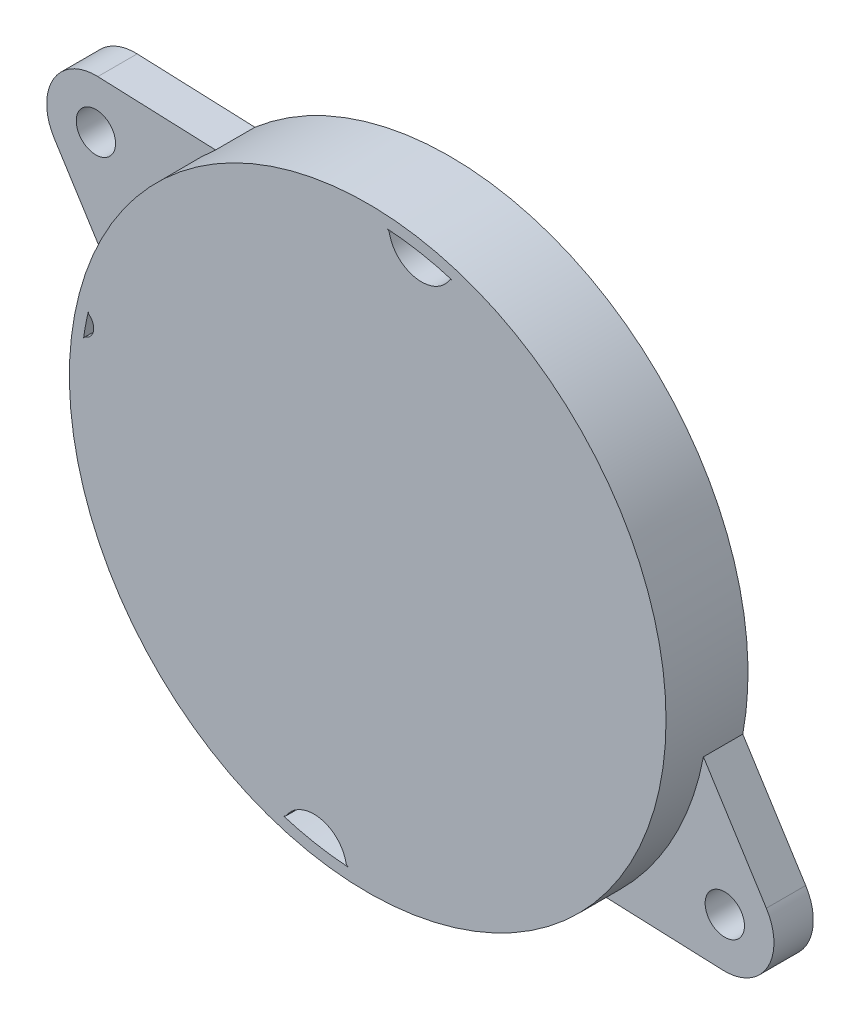
ISO-10303-21;
HEADER;
FILE_DESCRIPTION(('STEP AP214'),'2;1');
FILE_NAME('part.step','',(''),(''),'','','');
FILE_SCHEMA(('AUTOMOTIVE_DESIGN { 1 0 10303 214 1 1 1 1 }'));
ENDSEC;
DATA;
#1=APPLICATION_CONTEXT('core data for automotive mechanical design processes');
#2=APPLICATION_PROTOCOL_DEFINITION('international standard','automotive_design',2000,#1);
#3=PRODUCT_CONTEXT('',#1,'mechanical');
#4=PRODUCT('Part','Part','',(#3));
#5=PRODUCT_RELATED_PRODUCT_CATEGORY('part','',(#4));
#6=PRODUCT_DEFINITION_FORMATION('','',#4);
#7=PRODUCT_DEFINITION_CONTEXT('part definition',#1,'design');
#8=PRODUCT_DEFINITION('design','',#6,#7);
#9=PRODUCT_DEFINITION_SHAPE('','',#8);
#10=(LENGTH_UNIT() NAMED_UNIT(*) SI_UNIT(.MILLI.,.METRE.));
#11=(NAMED_UNIT(*) PLANE_ANGLE_UNIT() SI_UNIT($,.RADIAN.));
#12=(NAMED_UNIT(*) SI_UNIT($,.STERADIAN.) SOLID_ANGLE_UNIT());
#13=UNCERTAINTY_MEASURE_WITH_UNIT(LENGTH_MEASURE(1.E-05),#10,'distance_accuracy_value','');
#14=(GEOMETRIC_REPRESENTATION_CONTEXT(3) GLOBAL_UNCERTAINTY_ASSIGNED_CONTEXT((#13)) GLOBAL_UNIT_ASSIGNED_CONTEXT((#10,
#11,#12)) REPRESENTATION_CONTEXT('',''));
#15=CARTESIAN_POINT('',(0.,0.,0.));
#16=DIRECTION('',(0.,0.,1.));
#17=DIRECTION('',(1.,0.,0.));
#18=AXIS2_PLACEMENT_3D('',#15,#16,#17);
#19=CARTESIAN_POINT('',(0.,0.,5.));
#20=DIRECTION('',(0.,0.,-1.));
#21=DIRECTION('',(-1.,0.,0.));
#22=AXIS2_PLACEMENT_3D('',#19,#20,#21);
#23=CYLINDRICAL_SURFACE('',#22,18.2);
#24=CARTESIAN_POINT('',(0.,0.,5.));
#25=DIRECTION('',(0.,0.,1.));
#26=DIRECTION('',(1.,0.,0.));
#27=AXIS2_PLACEMENT_3D('',#24,#25,#26);
#28=CIRCLE('',#27,18.2);
#29=CARTESIAN_POINT('',(18.2,0.,5.));
#30=VERTEX_POINT('',#29);
#31=EDGE_CURVE('E346',#30,#30,#28,.T.);
#32=ORIENTED_EDGE('',*,*,#31,.F.);
#33=EDGE_LOOP('',(#32));
#34=FACE_BOUND('',#33,.T.);
#35=DIRECTION('',(0.,0.,-1.));
#36=VECTOR('',#35,1.);
#37=CARTESIAN_POINT('',(11.8804319684403,-13.7875065274059,2.4));
#38=LINE('',#37,#36);
#39=CARTESIAN_POINT('',(11.8804319684403,-13.7875065274059,2.4));
#40=VERTEX_POINT('',#39);
#41=CARTESIAN_POINT('',(11.8804319684403,-13.7875065274059,0.));
#42=VERTEX_POINT('',#41);
#43=EDGE_CURVE('E55',#40,#42,#38,.T.);
#44=ORIENTED_EDGE('',*,*,#43,.F.);
#45=CARTESIAN_POINT('',(0.,0.,2.4));
#46=DIRECTION('',(0.,0.,-1.));
#47=DIRECTION('',(1.,0.,0.));
#48=AXIS2_PLACEMENT_3D('',#45,#46,#47);
#49=CIRCLE('',#48,18.2);
#50=CARTESIAN_POINT('',(17.8805468917975,-3.39500262889909,2.4));
#51=VERTEX_POINT('',#50);
#52=EDGE_CURVE('E60',#51,#40,#49,.T.);
#53=ORIENTED_EDGE('',*,*,#52,.F.);
#54=DIRECTION('',(0.,0.,-1.));
#55=VECTOR('',#54,1.);
#56=CARTESIAN_POINT('',(17.8805468917975,-3.39500262889909,2.4));
#57=LINE('',#56,#55);
#58=CARTESIAN_POINT('',(17.8805468917975,-3.39500262889909,0.));
#59=VERTEX_POINT('',#58);
#60=EDGE_CURVE('E198',#51,#59,#57,.T.);
#61=ORIENTED_EDGE('',*,*,#60,.T.);
#62=CARTESIAN_POINT('',(0.,0.,0.));
#63=DIRECTION('',(0.,0.,1.));
#64=DIRECTION('',(1.,0.,0.));
#65=AXIS2_PLACEMENT_3D('',#62,#63,#64);
#66=CIRCLE('',#65,18.2);
#67=CARTESIAN_POINT('',(-11.8804319684404,13.7875065274059,0.));
#68=VERTEX_POINT('',#67);
#69=EDGE_CURVE('E339',#59,#68,#66,.T.);
#70=ORIENTED_EDGE('',*,*,#69,.T.);
#71=DIRECTION('',(0.,0.,-1.));
#72=VECTOR('',#71,1.);
#73=CARTESIAN_POINT('',(-11.8804319684403,13.7875065274059,2.4));
#74=LINE('',#73,#72);
#75=CARTESIAN_POINT('',(-11.8804319684403,13.7875065274059,2.4));
#76=VERTEX_POINT('',#75);
#77=EDGE_CURVE('E240',#76,#68,#74,.T.);
#78=ORIENTED_EDGE('',*,*,#77,.F.);
#79=CARTESIAN_POINT('',(0.,0.,2.4));
#80=DIRECTION('',(0.,0.,-1.));
#81=DIRECTION('',(1.,0.,0.));
#82=AXIS2_PLACEMENT_3D('',#79,#80,#81);
#83=CIRCLE('',#82,18.2);
#84=CARTESIAN_POINT('',(-17.8805468917975,3.3950026288991,2.4));
#85=VERTEX_POINT('',#84);
#86=EDGE_CURVE('E226',#85,#76,#83,.T.);
#87=ORIENTED_EDGE('',*,*,#86,.F.);
#88=DIRECTION('',(0.,0.,-1.));
#89=VECTOR('',#88,1.);
#90=CARTESIAN_POINT('',(-17.8805468917975,3.39500262889908,2.4));
#91=LINE('',#90,#89);
#92=CARTESIAN_POINT('',(-17.8805468917975,3.39500262889908,0.));
#93=VERTEX_POINT('',#92);
#94=EDGE_CURVE('E243',#85,#93,#91,.T.);
#95=ORIENTED_EDGE('',*,*,#94,.T.);
#96=EDGE_CURVE('E350',#93,#42,#66,.T.);
#97=ORIENTED_EDGE('',*,*,#96,.T.);
#98=EDGE_LOOP('',(#44,#53,#61,#70,#78,#87,#95,#97));
#99=FACE_BOUND('',#98,.T.);
#100=ADVANCED_FACE('F39',(#34,#99),#23,.T.);
#101=CARTESIAN_POINT('',(0.,0.,5.));
#102=DIRECTION('',(0.,0.,1.));
#103=DIRECTION('',(1.,0.,0.));
#104=AXIS2_PLACEMENT_3D('',#101,#102,#103);
#105=PLANE('',#104);
#106=CARTESIAN_POINT('',(-5.14026382170794,-16.518707208594,5.));
#107=DIRECTION('',(0.,0.,-1.));
#108=DIRECTION('',(1.,0.,0.));
#109=AXIS2_PLACEMENT_3D('',#106,#107,#108);
#110=CIRCLE('',#109,0.200000000000027);
#111=CARTESIAN_POINT('',(-4.97142911747537,-16.6259212125613,5.));
#112=VERTEX_POINT('',#111);
#113=CARTESIAN_POINT('',(-5.19968883698777,-16.7096749219882,5.));
#114=VERTEX_POINT('',#113);
#115=EDGE_CURVE('E249',#112,#114,#110,.T.);
#116=ORIENTED_EDGE('',*,*,#115,.F.);
#117=CARTESIAN_POINT('',(-3.28308207514968,-17.6980612522336,5.));
#118=DIRECTION('',(0.,0.,1.));
#119=DIRECTION('',(1.,0.,0.));
#120=AXIS2_PLACEMENT_3D('',#117,#118,#119);
#121=CIRCLE('',#120,1.99999999999958);
#122=CARTESIAN_POINT('',(-1.32252662844535,-17.3028115331997,5.));
#123=VERTEX_POINT('',#122);
#124=EDGE_CURVE('E254',#123,#112,#121,.T.);
#125=ORIENTED_EDGE('',*,*,#124,.F.);
#126=CARTESIAN_POINT('',(-1.12647108377492,-17.2632865612964,5.));
#127=DIRECTION('',(0.,0.,-1.));
#128=DIRECTION('',(1.,0.,0.));
#129=AXIS2_PLACEMENT_3D('',#126,#127,#128);
#130=CIRCLE('',#129,0.199999999999947);
#131=CARTESIAN_POINT('',(-1.13949387087031,-17.462862128479,5.));
#132=VERTEX_POINT('',#131);
#133=EDGE_CURVE('E268',#132,#123,#130,.T.);
#134=ORIENTED_EDGE('',*,*,#133,.F.);
#135=CARTESIAN_POINT('',(0.,0.,5.));
#136=DIRECTION('',(0.,0.,1.));
#137=DIRECTION('',(1.,0.,0.));
#138=AXIS2_PLACEMENT_3D('',#135,#136,#137);
#139=CIRCLE('',#138,17.5000000000005);
#140=EDGE_CURVE('E265',#114,#132,#139,.T.);
#141=ORIENTED_EDGE('',*,*,#140,.F.);
#142=EDGE_LOOP('',(#116,#125,#134,#141));
#143=FACE_BOUND('',#142,.T.);
#144=CARTESIAN_POINT('',(-17.1398682288803,2.34838606209299,5.));
#145=DIRECTION('',(0.,0.,-1.));
#146=DIRECTION('',(1.,0.,0.));
#147=AXIS2_PLACEMENT_3D('',#144,#145,#146);
#148=CIRCLE('',#147,0.200000000000096);
#149=CARTESIAN_POINT('',(-17.3380169945322,2.37553503390913,5.));
#150=VERTEX_POINT('',#149);
#151=CARTESIAN_POINT('',(-17.2087634572799,2.53614507653386,5.));
#152=VERTEX_POINT('',#151);
#153=EDGE_CURVE('E275',#150,#152,#148,.T.);
#154=ORIENTED_EDGE('',*,*,#153,.F.);
#155=CARTESIAN_POINT('',(0.,0.,5.));
#156=DIRECTION('',(0.,0.,1.));
#157=DIRECTION('',(1.,0.,0.));
#158=AXIS2_PLACEMENT_3D('',#155,#156,#157);
#159=CIRCLE('',#158,17.5000000000005);
#160=CARTESIAN_POINT('',(-17.0364645222436,4.00110941894269,5.));
#161=VERTEX_POINT('',#160);
#162=EDGE_CURVE('E286',#161,#150,#159,.T.);
#163=ORIENTED_EDGE('',*,*,#162,.F.);
#164=CARTESIAN_POINT('',(-16.8417620705608,3.95538245415476,5.));
#165=DIRECTION('',(0.,0.,-1.));
#166=DIRECTION('',(1.,0.,0.));
#167=AXIS2_PLACEMENT_3D('',#164,#165,#166);
#168=CIRCLE('',#167,0.200000000000049);
#169=CARTESIAN_POINT('',(-16.9734164901856,3.80482643868781,5.));
#170=VERTEX_POINT('',#169);
#171=EDGE_CURVE('E300',#170,#161,#168,.T.);
#172=ORIENTED_EDGE('',*,*,#171,.F.);
#173=CARTESIAN_POINT('',(-17.4671205637782,3.24024138068679,5.));
#174=DIRECTION('',(0.,0.,1.));
#175=DIRECTION('',(1.,0.,0.));
#176=AXIS2_PLACEMENT_3D('',#173,#174,#175);
#177=CIRCLE('',#176,0.749999999999997);
#178=EDGE_CURVE('E297',#152,#170,#177,.T.);
#179=ORIENTED_EDGE('',*,*,#178,.F.);
#180=EDGE_LOOP('',(#154,#163,#172,#179));
#181=FACE_BOUND('',#180,.T.);
#182=CARTESIAN_POINT('',(1.12647108377452,17.2632865612962,5.));
#183=DIRECTION('',(0.,0.,-1.));
#184=DIRECTION('',(1.,0.,0.));
#185=AXIS2_PLACEMENT_3D('',#182,#183,#184);
#186=CIRCLE('',#185,0.200000000000272);
#187=CARTESIAN_POINT('',(1.1394938708702,17.462862128479,5.));
#188=VERTEX_POINT('',#187);
#189=CARTESIAN_POINT('',(1.32252662844519,17.3028115331998,5.));
#190=VERTEX_POINT('',#189);
#191=EDGE_CURVE('E307',#188,#190,#186,.T.);
#192=ORIENTED_EDGE('',*,*,#191,.F.);
#193=CARTESIAN_POINT('',(0.,0.,5.));
#194=DIRECTION('',(0.,0.,1.));
#195=DIRECTION('',(1.,0.,0.));
#196=AXIS2_PLACEMENT_3D('',#193,#194,#195);
#197=CIRCLE('',#196,17.5000000000005);
#198=CARTESIAN_POINT('',(5.19968883698771,16.7096749219883,5.));
#199=VERTEX_POINT('',#198);
#200=EDGE_CURVE('E318',#199,#188,#197,.T.);
#201=ORIENTED_EDGE('',*,*,#200,.F.);
#202=CARTESIAN_POINT('',(5.14026382170795,16.5187072085941,5.));
#203=DIRECTION('',(0.,0.,-1.));
#204=DIRECTION('',(1.,0.,0.));
#205=AXIS2_PLACEMENT_3D('',#202,#203,#204);
#206=CIRCLE('',#205,0.200000000000072);
#207=CARTESIAN_POINT('',(4.97142911747514,16.6259212125614,5.));
#208=VERTEX_POINT('',#207);
#209=EDGE_CURVE('E332',#208,#199,#206,.T.);
#210=ORIENTED_EDGE('',*,*,#209,.F.);
#211=CARTESIAN_POINT('',(3.28308207514946,17.6980612522336,5.));
#212=DIRECTION('',(0.,0.,1.));
#213=DIRECTION('',(1.,0.,0.));
#214=AXIS2_PLACEMENT_3D('',#211,#212,#213);
#215=CIRCLE('',#214,1.99999999999953);
#216=EDGE_CURVE('E329',#190,#208,#215,.T.);
#217=ORIENTED_EDGE('',*,*,#216,.F.);
#218=EDGE_LOOP('',(#192,#201,#210,#217));
#219=FACE_BOUND('',#218,.T.);
#220=ORIENTED_EDGE('',*,*,#31,.T.);
#221=EDGE_LOOP('',(#220));
#222=FACE_BOUND('',#221,.T.);
#223=ADVANCED_FACE('F376',(#143,#181,#219,#222),#105,.T.);
#224=CARTESIAN_POINT('',(0.,0.,0.));
#225=DIRECTION('',(0.,0.,1.));
#226=DIRECTION('',(1.,0.,0.));
#227=AXIS2_PLACEMENT_3D('',#224,#225,#226);
#228=PLANE('',#227);
#229=CARTESIAN_POINT('',(0.,0.,0.));
#230=DIRECTION('',(0.,0.,-1.));
#231=DIRECTION('',(1.,0.,0.));
#232=AXIS2_PLACEMENT_3D('',#229,#230,#231);
#233=CIRCLE('',#232,8.25);
#234=CARTESIAN_POINT('',(8.25,0.,0.));
#235=VERTEX_POINT('',#234);
#236=EDGE_CURVE('E742',#235,#235,#233,.T.);
#237=ORIENTED_EDGE('',*,*,#236,.F.);
#238=EDGE_LOOP('',(#237));
#239=FACE_BOUND('',#238,.T.);
#240=ORIENTED_EDGE('',*,*,#96,.F.);
#241=DIRECTION('',(0.533946831385359,-0.845518054954201,0.));
#242=VECTOR('',#241,1.);
#243=CARTESIAN_POINT('',(-17.8805468917975,3.39500262889909,0.));
#244=LINE('',#243,#242);
#245=CARTESIAN_POINT('',(-21.7188622634898,9.47307025026462,0.));
#246=VERTEX_POINT('',#245);
#247=EDGE_CURVE('E234',#246,#93,#244,.T.);
#248=ORIENTED_EDGE('',*,*,#247,.F.);
#249=CARTESIAN_POINT('',(-19.1823080986272,11.0749107444207,0.));
#250=DIRECTION('',(0.,0.,1.));
#251=DIRECTION('',(1.,0.,0.));
#252=AXIS2_PLACEMENT_3D('',#249,#250,#251);
#253=CIRCLE('',#252,2.99999999999999);
#254=CARTESIAN_POINT('',(-19.0633506203087,14.072551336345,0.));
#255=VERTEX_POINT('',#254);
#256=EDGE_CURVE('E216',#255,#246,#253,.T.);
#257=ORIENTED_EDGE('',*,*,#256,.F.);
#258=DIRECTION('',(-0.999213530641425,0.0396524927728228,0.));
#259=VECTOR('',#258,1.);
#260=CARTESIAN_POINT('',(-19.0633506203087,14.072551336345,0.));
#261=LINE('',#260,#259);
#262=EDGE_CURVE('E223',#68,#255,#261,.T.);
#263=ORIENTED_EDGE('',*,*,#262,.F.);
#264=ORIENTED_EDGE('',*,*,#69,.F.);
#265=DIRECTION('',(-0.533946831385357,0.845518054954202,0.));
#266=VECTOR('',#265,1.);
#267=CARTESIAN_POINT('',(17.8805468917975,-3.39500262889909,0.));
#268=LINE('',#267,#266);
#269=CARTESIAN_POINT('',(21.7188622634898,-9.47307025026462,0.));
#270=VERTEX_POINT('',#269);
#271=EDGE_CURVE('E206',#270,#59,#268,.T.);
#272=ORIENTED_EDGE('',*,*,#271,.F.);
#273=CARTESIAN_POINT('',(19.1823080986272,-11.0749107444207,0.));
#274=DIRECTION('',(0.,0.,1.));
#275=DIRECTION('',(1.,0.,0.));
#276=AXIS2_PLACEMENT_3D('',#273,#274,#275);
#277=CIRCLE('',#276,2.99999999999999);
#278=CARTESIAN_POINT('',(19.0633506203087,-14.072551336345,0.));
#279=VERTEX_POINT('',#278);
#280=EDGE_CURVE('E203',#279,#270,#277,.T.);
#281=ORIENTED_EDGE('',*,*,#280,.F.);
#282=DIRECTION('',(0.999213530641425,-0.0396524927728223,0.));
#283=VECTOR('',#282,1.);
#284=CARTESIAN_POINT('',(19.0633506203087,-14.072551336345,0.));
#285=LINE('',#284,#283);
#286=EDGE_CURVE('E188',#42,#279,#285,.T.);
#287=ORIENTED_EDGE('',*,*,#286,.F.);
#288=EDGE_LOOP('',(#240,#248,#257,#263,#264,#272,#281,#287));
#289=FACE_BOUND('',#288,.T.);
#290=CARTESIAN_POINT('',(-19.1823080986272,11.0749107444207,0.));
#291=DIRECTION('',(0.,0.,1.));
#292=DIRECTION('',(1.,0.,0.));
#293=AXIS2_PLACEMENT_3D('',#290,#291,#292);
#294=CIRCLE('',#293,1.2);
#295=CARTESIAN_POINT('',(-17.9823080986272,11.0749107444207,0.));
#296=VERTEX_POINT('',#295);
#297=EDGE_CURVE('E212',#296,#296,#294,.T.);
#298=ORIENTED_EDGE('',*,*,#297,.T.);
#299=EDGE_LOOP('',(#298));
#300=FACE_BOUND('',#299,.T.);
#301=CARTESIAN_POINT('',(19.1823080986272,-11.0749107444207,0.));
#302=DIRECTION('',(0.,0.,1.));
#303=DIRECTION('',(1.,0.,0.));
#304=AXIS2_PLACEMENT_3D('',#301,#302,#303);
#305=CIRCLE('',#304,1.2);
#306=CARTESIAN_POINT('',(20.3823080986272,-11.0749107444207,0.));
#307=VERTEX_POINT('',#306);
#308=EDGE_CURVE('E749',#307,#307,#305,.T.);
#309=ORIENTED_EDGE('',*,*,#308,.T.);
#310=EDGE_LOOP('',(#309));
#311=FACE_BOUND('',#310,.T.);
#312=ADVANCED_FACE('F382',(#239,#289,#300,#311),#228,.F.);
#313=CARTESIAN_POINT('',(1.12647108377452,17.2632865612962,3.));
#314=DIRECTION('',(0.,0.,1.));
#315=DIRECTION('',(1.,0.,0.));
#316=AXIS2_PLACEMENT_3D('',#313,#314,#315);
#317=CYLINDRICAL_SURFACE('',#316,0.200000000000272);
#318=ORIENTED_EDGE('',*,*,#191,.T.);
#319=DIRECTION('',(0.,0.,1.));
#320=VECTOR('',#319,1.);
#321=CARTESIAN_POINT('',(1.32252662844519,17.3028115331998,3.));
#322=LINE('',#321,#320);
#323=CARTESIAN_POINT('',(1.32252662844519,17.3028115331998,3.));
#324=VERTEX_POINT('',#323);
#325=EDGE_CURVE('E327',#324,#190,#322,.T.);
#326=ORIENTED_EDGE('',*,*,#325,.F.);
#327=CARTESIAN_POINT('',(1.12647108377452,17.2632865612962,3.));
#328=DIRECTION('',(0.,0.,-1.));
#329=DIRECTION('',(1.,0.,0.));
#330=AXIS2_PLACEMENT_3D('',#327,#328,#329);
#331=CIRCLE('',#330,0.200000000000272);
#332=CARTESIAN_POINT('',(1.1394938708702,17.462862128479,3.));
#333=VERTEX_POINT('',#332);
#334=EDGE_CURVE('E314',#333,#324,#331,.T.);
#335=ORIENTED_EDGE('',*,*,#334,.F.);
#336=DIRECTION('',(0.,0.,1.));
#337=VECTOR('',#336,1.);
#338=CARTESIAN_POINT('',(1.1394938708702,17.462862128479,3.));
#339=LINE('',#338,#337);
#340=EDGE_CURVE('E337',#333,#188,#339,.T.);
#341=ORIENTED_EDGE('',*,*,#340,.T.);
#342=EDGE_LOOP('',(#318,#326,#335,#341));
#343=FACE_BOUND('',#342,.T.);
#344=ADVANCED_FACE('F388',(#343),#317,.T.);
#345=CARTESIAN_POINT('',(0.,0.,3.));
#346=DIRECTION('',(0.,0.,1.));
#347=DIRECTION('',(1.,0.,0.));
#348=AXIS2_PLACEMENT_3D('',#345,#346,#347);
#349=CYLINDRICAL_SURFACE('',#348,17.5000000000005);
#350=ORIENTED_EDGE('',*,*,#200,.T.);
#351=ORIENTED_EDGE('',*,*,#340,.F.);
#352=CARTESIAN_POINT('',(0.,0.,3.));
#353=DIRECTION('',(0.,0.,1.));
#354=DIRECTION('',(1.,0.,0.));
#355=AXIS2_PLACEMENT_3D('',#352,#353,#354);
#356=CIRCLE('',#355,17.5000000000005);
#357=CARTESIAN_POINT('',(5.19968883698771,16.7096749219883,3.));
#358=VERTEX_POINT('',#357);
#359=EDGE_CURVE('E324',#358,#333,#356,.T.);
#360=ORIENTED_EDGE('',*,*,#359,.F.);
#361=DIRECTION('',(0.,0.,1.));
#362=VECTOR('',#361,1.);
#363=CARTESIAN_POINT('',(5.19968883698771,16.7096749219883,3.));
#364=LINE('',#363,#362);
#365=EDGE_CURVE('E340',#358,#199,#364,.T.);
#366=ORIENTED_EDGE('',*,*,#365,.T.);
#367=EDGE_LOOP('',(#350,#351,#360,#366));
#368=FACE_BOUND('',#367,.T.);
#369=ADVANCED_FACE('F393',(#368),#349,.F.);
#370=CARTESIAN_POINT('',(5.14026382170795,16.5187072085941,3.));
#371=DIRECTION('',(0.,0.,1.));
#372=DIRECTION('',(1.,0.,0.));
#373=AXIS2_PLACEMENT_3D('',#370,#371,#372);
#374=CYLINDRICAL_SURFACE('',#373,0.200000000000072);
#375=ORIENTED_EDGE('',*,*,#209,.T.);
#376=ORIENTED_EDGE('',*,*,#365,.F.);
#377=CARTESIAN_POINT('',(5.14026382170795,16.5187072085941,3.));
#378=DIRECTION('',(0.,0.,-1.));
#379=DIRECTION('',(1.,0.,0.));
#380=AXIS2_PLACEMENT_3D('',#377,#378,#379);
#381=CIRCLE('',#380,0.200000000000072);
#382=CARTESIAN_POINT('',(4.97142911747514,16.6259212125614,3.));
#383=VERTEX_POINT('',#382);
#384=EDGE_CURVE('E321',#383,#358,#381,.T.);
#385=ORIENTED_EDGE('',*,*,#384,.F.);
#386=DIRECTION('',(0.,0.,1.));
#387=VECTOR('',#386,1.);
#388=CARTESIAN_POINT('',(4.97142911747514,16.6259212125614,3.));
#389=LINE('',#388,#387);
#390=EDGE_CURVE('E342',#383,#208,#389,.T.);
#391=ORIENTED_EDGE('',*,*,#390,.T.);
#392=EDGE_LOOP('',(#375,#376,#385,#391));
#393=FACE_BOUND('',#392,.T.);
#394=ADVANCED_FACE('F399',(#393),#374,.T.);
#395=CARTESIAN_POINT('',(3.28308207514946,17.6980612522336,3.));
#396=DIRECTION('',(0.,0.,1.));
#397=DIRECTION('',(1.,0.,0.));
#398=AXIS2_PLACEMENT_3D('',#395,#396,#397);
#399=CYLINDRICAL_SURFACE('',#398,1.99999999999953);
#400=ORIENTED_EDGE('',*,*,#216,.T.);
#401=ORIENTED_EDGE('',*,*,#390,.F.);
#402=CARTESIAN_POINT('',(3.28308207514946,17.6980612522336,3.));
#403=DIRECTION('',(0.,0.,1.));
#404=DIRECTION('',(1.,0.,0.));
#405=AXIS2_PLACEMENT_3D('',#402,#403,#404);
#406=CIRCLE('',#405,1.99999999999953);
#407=EDGE_CURVE('E317',#324,#383,#406,.T.);
#408=ORIENTED_EDGE('',*,*,#407,.F.);
#409=ORIENTED_EDGE('',*,*,#325,.T.);
#410=EDGE_LOOP('',(#400,#401,#408,#409));
#411=FACE_BOUND('',#410,.T.);
#412=ADVANCED_FACE('F395',(#411),#399,.F.);
#413=CARTESIAN_POINT('',(0.563235541887261,8.6316432806481,3.));
#414=DIRECTION('',(0.,0.,1.));
#415=DIRECTION('',(1.,0.,0.));
#416=AXIS2_PLACEMENT_3D('',#413,#414,#415);
#417=PLANE('',#416);
#418=ORIENTED_EDGE('',*,*,#334,.T.);
#419=ORIENTED_EDGE('',*,*,#407,.T.);
#420=ORIENTED_EDGE('',*,*,#384,.T.);
#421=ORIENTED_EDGE('',*,*,#359,.T.);
#422=EDGE_LOOP('',(#418,#419,#420,#421));
#423=FACE_BOUND('',#422,.T.);
#424=ADVANCED_FACE('F398',(#423),#417,.T.);
#425=CARTESIAN_POINT('',(-17.1398682288803,2.34838606209299,3.));
#426=DIRECTION('',(0.,0.,1.));
#427=DIRECTION('',(1.,0.,0.));
#428=AXIS2_PLACEMENT_3D('',#425,#426,#427);
#429=CYLINDRICAL_SURFACE('',#428,0.200000000000096);
#430=ORIENTED_EDGE('',*,*,#153,.T.);
#431=DIRECTION('',(0.,0.,1.));
#432=VECTOR('',#431,1.);
#433=CARTESIAN_POINT('',(-17.2087634572799,2.53614507653386,3.));
#434=LINE('',#433,#432);
#435=CARTESIAN_POINT('',(-17.2087634572799,2.53614507653386,3.));
#436=VERTEX_POINT('',#435);
#437=EDGE_CURVE('E295',#436,#152,#434,.T.);
#438=ORIENTED_EDGE('',*,*,#437,.F.);
#439=CARTESIAN_POINT('',(-17.1398682288803,2.34838606209299,3.));
#440=DIRECTION('',(0.,0.,-1.));
#441=DIRECTION('',(1.,0.,0.));
#442=AXIS2_PLACEMENT_3D('',#439,#440,#441);
#443=CIRCLE('',#442,0.200000000000096);
#444=CARTESIAN_POINT('',(-17.3380169945322,2.37553503390913,3.));
#445=VERTEX_POINT('',#444);
#446=EDGE_CURVE('E282',#445,#436,#443,.T.);
#447=ORIENTED_EDGE('',*,*,#446,.F.);
#448=DIRECTION('',(0.,0.,1.));
#449=VECTOR('',#448,1.);
#450=CARTESIAN_POINT('',(-17.3380169945322,2.37553503390913,3.));
#451=LINE('',#450,#449);
#452=EDGE_CURVE('E305',#445,#150,#451,.T.);
#453=ORIENTED_EDGE('',*,*,#452,.T.);
#454=EDGE_LOOP('',(#430,#438,#447,#453));
#455=FACE_BOUND('',#454,.T.);
#456=ADVANCED_FACE('F409',(#455),#429,.T.);
#457=CARTESIAN_POINT('',(0.,0.,3.));
#458=DIRECTION('',(0.,0.,1.));
#459=DIRECTION('',(1.,0.,0.));
#460=AXIS2_PLACEMENT_3D('',#457,#458,#459);
#461=CYLINDRICAL_SURFACE('',#460,17.5000000000005);
#462=ORIENTED_EDGE('',*,*,#162,.T.);
#463=ORIENTED_EDGE('',*,*,#452,.F.);
#464=CARTESIAN_POINT('',(0.,0.,3.));
#465=DIRECTION('',(0.,0.,1.));
#466=DIRECTION('',(1.,0.,0.));
#467=AXIS2_PLACEMENT_3D('',#464,#465,#466);
#468=CIRCLE('',#467,17.5000000000005);
#469=CARTESIAN_POINT('',(-17.0364645222436,4.00110941894269,3.));
#470=VERTEX_POINT('',#469);
#471=EDGE_CURVE('E292',#470,#445,#468,.T.);
#472=ORIENTED_EDGE('',*,*,#471,.F.);
#473=DIRECTION('',(0.,0.,1.));
#474=VECTOR('',#473,1.);
#475=CARTESIAN_POINT('',(-17.0364645222436,4.00110941894269,3.));
#476=LINE('',#475,#474);
#477=EDGE_CURVE('E308',#470,#161,#476,.T.);
#478=ORIENTED_EDGE('',*,*,#477,.T.);
#479=EDGE_LOOP('',(#462,#463,#472,#478));
#480=FACE_BOUND('',#479,.T.);
#481=ADVANCED_FACE('F413',(#480),#461,.F.);
#482=CARTESIAN_POINT('',(-16.8417620705608,3.95538245415476,3.));
#483=DIRECTION('',(0.,0.,1.));
#484=DIRECTION('',(1.,0.,0.));
#485=AXIS2_PLACEMENT_3D('',#482,#483,#484);
#486=CYLINDRICAL_SURFACE('',#485,0.200000000000049);
#487=ORIENTED_EDGE('',*,*,#171,.T.);
#488=ORIENTED_EDGE('',*,*,#477,.F.);
#489=CARTESIAN_POINT('',(-16.8417620705608,3.95538245415476,3.));
#490=DIRECTION('',(0.,0.,-1.));
#491=DIRECTION('',(1.,0.,0.));
#492=AXIS2_PLACEMENT_3D('',#489,#490,#491);
#493=CIRCLE('',#492,0.200000000000049);
#494=CARTESIAN_POINT('',(-16.9734164901856,3.80482643868781,3.));
#495=VERTEX_POINT('',#494);
#496=EDGE_CURVE('E289',#495,#470,#493,.T.);
#497=ORIENTED_EDGE('',*,*,#496,.F.);
#498=DIRECTION('',(0.,0.,1.));
#499=VECTOR('',#498,1.);
#500=CARTESIAN_POINT('',(-16.9734164901856,3.80482643868781,3.));
#501=LINE('',#500,#499);
#502=EDGE_CURVE('E310',#495,#170,#501,.T.);
#503=ORIENTED_EDGE('',*,*,#502,.T.);
#504=EDGE_LOOP('',(#487,#488,#497,#503));
#505=FACE_BOUND('',#504,.T.);
#506=ADVANCED_FACE('F419',(#505),#486,.T.);
#507=CARTESIAN_POINT('',(-17.4671205637782,3.24024138068679,3.));
#508=DIRECTION('',(0.,0.,1.));
#509=DIRECTION('',(1.,0.,0.));
#510=AXIS2_PLACEMENT_3D('',#507,#508,#509);
#511=CYLINDRICAL_SURFACE('',#510,0.749999999999997);
#512=ORIENTED_EDGE('',*,*,#178,.T.);
#513=ORIENTED_EDGE('',*,*,#502,.F.);
#514=CARTESIAN_POINT('',(-17.4671205637782,3.24024138068679,3.));
#515=DIRECTION('',(0.,0.,1.));
#516=DIRECTION('',(1.,0.,0.));
#517=AXIS2_PLACEMENT_3D('',#514,#515,#516);
#518=CIRCLE('',#517,0.749999999999997);
#519=EDGE_CURVE('E285',#436,#495,#518,.T.);
#520=ORIENTED_EDGE('',*,*,#519,.F.);
#521=ORIENTED_EDGE('',*,*,#437,.T.);
#522=EDGE_LOOP('',(#512,#513,#520,#521));
#523=FACE_BOUND('',#522,.T.);
#524=ADVANCED_FACE('F415',(#523),#511,.F.);
#525=CARTESIAN_POINT('',(-8.56993411444017,1.17419303104649,3.));
#526=DIRECTION('',(0.,0.,1.));
#527=DIRECTION('',(1.,0.,0.));
#528=AXIS2_PLACEMENT_3D('',#525,#526,#527);
#529=PLANE('',#528);
#530=ORIENTED_EDGE('',*,*,#446,.T.);
#531=ORIENTED_EDGE('',*,*,#519,.T.);
#532=ORIENTED_EDGE('',*,*,#496,.T.);
#533=ORIENTED_EDGE('',*,*,#471,.T.);
#534=EDGE_LOOP('',(#530,#531,#532,#533));
#535=FACE_BOUND('',#534,.T.);
#536=ADVANCED_FACE('F418',(#535),#529,.T.);
#537=CARTESIAN_POINT('',(-5.14026382170794,-16.518707208594,3.));
#538=DIRECTION('',(0.,0.,1.));
#539=DIRECTION('',(1.,0.,0.));
#540=AXIS2_PLACEMENT_3D('',#537,#538,#539);
#541=CYLINDRICAL_SURFACE('',#540,0.200000000000027);
#542=ORIENTED_EDGE('',*,*,#115,.T.);
#543=DIRECTION('',(0.,0.,1.));
#544=VECTOR('',#543,1.);
#545=CARTESIAN_POINT('',(-5.19968883698777,-16.7096749219882,3.));
#546=LINE('',#545,#544);
#547=CARTESIAN_POINT('',(-5.19968883698777,-16.7096749219882,3.));
#548=VERTEX_POINT('',#547);
#549=EDGE_CURVE('E263',#548,#114,#546,.T.);
#550=ORIENTED_EDGE('',*,*,#549,.F.);
#551=CARTESIAN_POINT('',(-5.14026382170794,-16.518707208594,3.));
#552=DIRECTION('',(0.,0.,-1.));
#553=DIRECTION('',(1.,0.,0.));
#554=AXIS2_PLACEMENT_3D('',#551,#552,#553);
#555=CIRCLE('',#554,0.200000000000027);
#556=CARTESIAN_POINT('',(-4.97142911747537,-16.6259212125613,3.));
#557=VERTEX_POINT('',#556);
#558=EDGE_CURVE('E250',#557,#548,#555,.T.);
#559=ORIENTED_EDGE('',*,*,#558,.F.);
#560=DIRECTION('',(0.,0.,1.));
#561=VECTOR('',#560,1.);
#562=CARTESIAN_POINT('',(-4.97142911747537,-16.6259212125613,3.));
#563=LINE('',#562,#561);
#564=EDGE_CURVE('E273',#557,#112,#563,.T.);
#565=ORIENTED_EDGE('',*,*,#564,.T.);
#566=EDGE_LOOP('',(#542,#550,#559,#565));
#567=FACE_BOUND('',#566,.T.);
#568=ADVANCED_FACE('F429',(#567),#541,.T.);
#569=CARTESIAN_POINT('',(-3.28308207514968,-17.6980612522336,3.));
#570=DIRECTION('',(0.,0.,1.));
#571=DIRECTION('',(1.,0.,0.));
#572=AXIS2_PLACEMENT_3D('',#569,#570,#571);
#573=CYLINDRICAL_SURFACE('',#572,1.99999999999958);
#574=ORIENTED_EDGE('',*,*,#124,.T.);
#575=ORIENTED_EDGE('',*,*,#564,.F.);
#576=CARTESIAN_POINT('',(-3.28308207514968,-17.6980612522336,3.));
#577=DIRECTION('',(0.,0.,1.));
#578=DIRECTION('',(1.,0.,0.));
#579=AXIS2_PLACEMENT_3D('',#576,#577,#578);
#580=CIRCLE('',#579,1.99999999999958);
#581=CARTESIAN_POINT('',(-1.32252662844535,-17.3028115331997,3.));
#582=VERTEX_POINT('',#581);
#583=EDGE_CURVE('E260',#582,#557,#580,.T.);
#584=ORIENTED_EDGE('',*,*,#583,.F.);
#585=DIRECTION('',(0.,0.,1.));
#586=VECTOR('',#585,1.);
#587=CARTESIAN_POINT('',(-1.32252662844535,-17.3028115331997,3.));
#588=LINE('',#587,#586);
#589=EDGE_CURVE('E276',#582,#123,#588,.T.);
#590=ORIENTED_EDGE('',*,*,#589,.T.);
#591=EDGE_LOOP('',(#574,#575,#584,#590));
#592=FACE_BOUND('',#591,.T.);
#593=ADVANCED_FACE('F433',(#592),#573,.F.);
#594=CARTESIAN_POINT('',(-1.12647108377492,-17.2632865612964,3.));
#595=DIRECTION('',(0.,0.,1.));
#596=DIRECTION('',(1.,0.,0.));
#597=AXIS2_PLACEMENT_3D('',#594,#595,#596);
#598=CYLINDRICAL_SURFACE('',#597,0.199999999999947);
#599=ORIENTED_EDGE('',*,*,#133,.T.);
#600=ORIENTED_EDGE('',*,*,#589,.F.);
#601=CARTESIAN_POINT('',(-1.12647108377492,-17.2632865612964,3.));
#602=DIRECTION('',(0.,0.,-1.));
#603=DIRECTION('',(1.,0.,0.));
#604=AXIS2_PLACEMENT_3D('',#601,#602,#603);
#605=CIRCLE('',#604,0.199999999999947);
#606=CARTESIAN_POINT('',(-1.13949387087031,-17.462862128479,3.));
#607=VERTEX_POINT('',#606);
#608=EDGE_CURVE('E257',#607,#582,#605,.T.);
#609=ORIENTED_EDGE('',*,*,#608,.F.);
#610=DIRECTION('',(0.,0.,1.));
#611=VECTOR('',#610,1.);
#612=CARTESIAN_POINT('',(-1.13949387087031,-17.462862128479,3.));
#613=LINE('',#612,#611);
#614=EDGE_CURVE('E278',#607,#132,#613,.T.);
#615=ORIENTED_EDGE('',*,*,#614,.T.);
#616=EDGE_LOOP('',(#599,#600,#609,#615));
#617=FACE_BOUND('',#616,.T.);
#618=ADVANCED_FACE('F439',(#617),#598,.T.);
#619=CARTESIAN_POINT('',(0.,0.,3.));
#620=DIRECTION('',(0.,0.,1.));
#621=DIRECTION('',(1.,0.,0.));
#622=AXIS2_PLACEMENT_3D('',#619,#620,#621);
#623=CYLINDRICAL_SURFACE('',#622,17.5000000000005);
#624=ORIENTED_EDGE('',*,*,#140,.T.);
#625=ORIENTED_EDGE('',*,*,#614,.F.);
#626=CARTESIAN_POINT('',(0.,0.,3.));
#627=DIRECTION('',(0.,0.,1.));
#628=DIRECTION('',(1.,0.,0.));
#629=AXIS2_PLACEMENT_3D('',#626,#627,#628);
#630=CIRCLE('',#629,17.5000000000005);
#631=EDGE_CURVE('E253',#548,#607,#630,.T.);
#632=ORIENTED_EDGE('',*,*,#631,.F.);
#633=ORIENTED_EDGE('',*,*,#549,.T.);
#634=EDGE_LOOP('',(#624,#625,#632,#633));
#635=FACE_BOUND('',#634,.T.);
#636=ADVANCED_FACE('F435',(#635),#623,.F.);
#637=CARTESIAN_POINT('',(-4.21167294842881,-17.1083842304138,3.));
#638=DIRECTION('',(0.,0.,1.));
#639=DIRECTION('',(1.,0.,0.));
#640=AXIS2_PLACEMENT_3D('',#637,#638,#639);
#641=PLANE('',#640);
#642=ORIENTED_EDGE('',*,*,#558,.T.);
#643=ORIENTED_EDGE('',*,*,#631,.T.);
#644=ORIENTED_EDGE('',*,*,#608,.T.);
#645=ORIENTED_EDGE('',*,*,#583,.T.);
#646=EDGE_LOOP('',(#642,#643,#644,#645));
#647=FACE_BOUND('',#646,.T.);
#648=ADVANCED_FACE('F438',(#647),#641,.T.);
#649=CARTESIAN_POINT('',(-19.1823080986272,11.0749107444207,2.4));
#650=DIRECTION('',(0.,0.,1.));
#651=DIRECTION('',(1.,0.,0.));
#652=AXIS2_PLACEMENT_3D('',#649,#650,#651);
#653=PLANE('',#652);
#654=CARTESIAN_POINT('',(-19.1823080986272,11.0749107444207,2.4));
#655=DIRECTION('',(0.,0.,1.));
#656=DIRECTION('',(1.,0.,0.));
#657=AXIS2_PLACEMENT_3D('',#654,#655,#656);
#658=CIRCLE('',#657,2.99999999999999);
#659=CARTESIAN_POINT('',(-19.0633506203087,14.072551336345,2.4));
#660=VERTEX_POINT('',#659);
#661=CARTESIAN_POINT('',(-21.7188622634898,9.47307025026462,2.4));
#662=VERTEX_POINT('',#661);
#663=EDGE_CURVE('E219',#660,#662,#658,.T.);
#664=ORIENTED_EDGE('',*,*,#663,.T.);
#665=DIRECTION('',(0.533946831385359,-0.845518054954201,0.));
#666=VECTOR('',#665,1.);
#667=CARTESIAN_POINT('',(-17.8805468917975,3.39500262889909,2.4));
#668=LINE('',#667,#666);
#669=EDGE_CURVE('E222',#662,#85,#668,.T.);
#670=ORIENTED_EDGE('',*,*,#669,.T.);
#671=ORIENTED_EDGE('',*,*,#86,.T.);
#672=DIRECTION('',(-0.999213530641425,0.0396524927728228,0.));
#673=VECTOR('',#672,1.);
#674=CARTESIAN_POINT('',(-19.0633506203087,14.072551336345,2.4));
#675=LINE('',#674,#673);
#676=EDGE_CURVE('E229',#76,#660,#675,.T.);
#677=ORIENTED_EDGE('',*,*,#676,.T.);
#678=EDGE_LOOP('',(#664,#670,#671,#677));
#679=FACE_BOUND('',#678,.T.);
#680=CARTESIAN_POINT('',(-19.1823080986272,11.0749107444207,2.4));
#681=DIRECTION('',(0.,0.,1.));
#682=DIRECTION('',(1.,0.,0.));
#683=AXIS2_PLACEMENT_3D('',#680,#681,#682);
#684=CIRCLE('',#683,1.2);
#685=CARTESIAN_POINT('',(-17.9823080986272,11.0749107444207,2.4));
#686=VERTEX_POINT('',#685);
#687=EDGE_CURVE('E213',#686,#686,#684,.T.);
#688=ORIENTED_EDGE('',*,*,#687,.F.);
#689=EDGE_LOOP('',(#688));
#690=FACE_BOUND('',#689,.T.);
#691=ADVANCED_FACE('F449',(#679,#690),#653,.T.);
#692=CARTESIAN_POINT('',(-19.1823080986272,11.0749107444207,2.4));
#693=DIRECTION('',(0.,0.,-1.));
#694=DIRECTION('',(-1.,0.,0.));
#695=AXIS2_PLACEMENT_3D('',#692,#693,#694);
#696=CYLINDRICAL_SURFACE('',#695,2.99999999999999);
#697=ORIENTED_EDGE('',*,*,#256,.T.);
#698=DIRECTION('',(0.,0.,-1.));
#699=VECTOR('',#698,1.);
#700=CARTESIAN_POINT('',(-21.7188622634898,9.47307025026462,2.4));
#701=LINE('',#700,#699);
#702=EDGE_CURVE('E246',#662,#246,#701,.T.);
#703=ORIENTED_EDGE('',*,*,#702,.F.);
#704=ORIENTED_EDGE('',*,*,#663,.F.);
#705=DIRECTION('',(0.,0.,-1.));
#706=VECTOR('',#705,1.);
#707=CARTESIAN_POINT('',(-19.0633506203087,14.072551336345,2.4));
#708=LINE('',#707,#706);
#709=EDGE_CURVE('E231',#660,#255,#708,.T.);
#710=ORIENTED_EDGE('',*,*,#709,.T.);
#711=EDGE_LOOP('',(#697,#703,#704,#710));
#712=FACE_BOUND('',#711,.T.);
#713=ADVANCED_FACE('F451',(#712),#696,.T.);
#714=CARTESIAN_POINT('',(-17.8805468917975,3.39500262889909,2.4));
#715=DIRECTION('',(0.845518054954201,0.533946831385359,0.));
#716=DIRECTION('',(-0.533946831385359,0.845518054954201,0.));
#717=AXIS2_PLACEMENT_3D('',#714,#715,#716);
#718=PLANE('',#717);
#719=ORIENTED_EDGE('',*,*,#247,.T.);
#720=ORIENTED_EDGE('',*,*,#94,.F.);
#721=ORIENTED_EDGE('',*,*,#669,.F.);
#722=ORIENTED_EDGE('',*,*,#702,.T.);
#723=EDGE_LOOP('',(#719,#720,#721,#722));
#724=FACE_BOUND('',#723,.T.);
#725=ADVANCED_FACE('F454',(#724),#718,.F.);
#726=CARTESIAN_POINT('',(-19.0633506203087,14.072551336345,2.4));
#727=DIRECTION('',(-0.0396524927728228,-0.999213530641425,0.));
#728=DIRECTION('',(0.999213530641425,-0.0396524927728228,0.));
#729=AXIS2_PLACEMENT_3D('',#726,#727,#728);
#730=PLANE('',#729);
#731=ORIENTED_EDGE('',*,*,#262,.T.);
#732=ORIENTED_EDGE('',*,*,#709,.F.);
#733=ORIENTED_EDGE('',*,*,#676,.F.);
#734=ORIENTED_EDGE('',*,*,#77,.T.);
#735=EDGE_LOOP('',(#731,#732,#733,#734));
#736=FACE_BOUND('',#735,.T.);
#737=ADVANCED_FACE('F458',(#736),#730,.F.);
#738=CARTESIAN_POINT('',(-19.1823080986272,11.0749107444207,2.4));
#739=DIRECTION('',(0.,0.,-1.));
#740=DIRECTION('',(-1.,0.,0.));
#741=AXIS2_PLACEMENT_3D('',#738,#739,#740);
#742=CYLINDRICAL_SURFACE('',#741,1.2);
#743=ORIENTED_EDGE('',*,*,#687,.T.);
#744=EDGE_LOOP('',(#743));
#745=FACE_BOUND('',#744,.T.);
#746=ORIENTED_EDGE('',*,*,#297,.F.);
#747=EDGE_LOOP('',(#746));
#748=FACE_BOUND('',#747,.T.);
#749=ADVANCED_FACE('F462',(#745,#748),#742,.F.);
#750=CARTESIAN_POINT('',(0.,0.,2.4));
#751=DIRECTION('',(0.,0.,1.));
#752=DIRECTION('',(1.,0.,0.));
#753=AXIS2_PLACEMENT_3D('',#750,#751,#752);
#754=PLANE('',#753);
#755=ORIENTED_EDGE('',*,*,#52,.T.);
#756=DIRECTION('',(0.999213530641425,-0.0396524927728223,0.));
#757=VECTOR('',#756,1.);
#758=CARTESIAN_POINT('',(19.0633506203087,-14.072551336345,2.4));
#759=LINE('',#758,#757);
#760=CARTESIAN_POINT('',(19.0633506203087,-14.072551336345,2.4));
#761=VERTEX_POINT('',#760);
#762=EDGE_CURVE('E175',#40,#761,#759,.T.);
#763=ORIENTED_EDGE('',*,*,#762,.T.);
#764=CARTESIAN_POINT('',(19.1823080986272,-11.0749107444207,2.4));
#765=DIRECTION('',(0.,0.,1.));
#766=DIRECTION('',(1.,0.,0.));
#767=AXIS2_PLACEMENT_3D('',#764,#765,#766);
#768=CIRCLE('',#767,2.99999999999999);
#769=CARTESIAN_POINT('',(21.7188622634898,-9.47307025026462,2.4));
#770=VERTEX_POINT('',#769);
#771=EDGE_CURVE('E180',#761,#770,#768,.T.);
#772=ORIENTED_EDGE('',*,*,#771,.T.);
#773=DIRECTION('',(-0.533946831385357,0.845518054954202,0.));
#774=VECTOR('',#773,1.);
#775=CARTESIAN_POINT('',(17.8805468917975,-3.39500262889909,2.4));
#776=LINE('',#775,#774);
#777=EDGE_CURVE('E196',#770,#51,#776,.T.);
#778=ORIENTED_EDGE('',*,*,#777,.T.);
#779=EDGE_LOOP('',(#755,#763,#772,#778));
#780=FACE_BOUND('',#779,.T.);
#781=CARTESIAN_POINT('',(19.1823080986272,-11.0749107444207,2.4));
#782=DIRECTION('',(0.,0.,1.));
#783=DIRECTION('',(1.,0.,0.));
#784=AXIS2_PLACEMENT_3D('',#781,#782,#783);
#785=CIRCLE('',#784,1.2);
#786=CARTESIAN_POINT('',(20.3823080986272,-11.0749107444207,2.4));
#787=VERTEX_POINT('',#786);
#788=EDGE_CURVE('E204',#787,#787,#785,.T.);
#789=ORIENTED_EDGE('',*,*,#788,.F.);
#790=EDGE_LOOP('',(#789));
#791=FACE_BOUND('',#790,.T.);
#792=ADVANCED_FACE('F177',(#780,#791),#754,.T.);
#793=CARTESIAN_POINT('',(19.0633506203087,-14.072551336345,2.4));
#794=DIRECTION('',(0.0396524927728223,0.999213530641425,0.));
#795=DIRECTION('',(-0.999213530641425,0.0396524927728224,0.));
#796=AXIS2_PLACEMENT_3D('',#793,#794,#795);
#797=PLANE('',#796);
#798=ORIENTED_EDGE('',*,*,#286,.T.);
#799=DIRECTION('',(0.,0.,-1.));
#800=VECTOR('',#799,1.);
#801=CARTESIAN_POINT('',(19.0633506203087,-14.072551336345,2.4));
#802=LINE('',#801,#800);
#803=EDGE_CURVE('E185',#761,#279,#802,.T.);
#804=ORIENTED_EDGE('',*,*,#803,.F.);
#805=ORIENTED_EDGE('',*,*,#762,.F.);
#806=ORIENTED_EDGE('',*,*,#43,.T.);
#807=EDGE_LOOP('',(#798,#804,#805,#806));
#808=FACE_BOUND('',#807,.T.);
#809=ADVANCED_FACE('F186',(#808),#797,.F.);
#810=CARTESIAN_POINT('',(19.1823080986272,-11.0749107444207,2.4));
#811=DIRECTION('',(0.,0.,-1.));
#812=DIRECTION('',(-1.,0.,0.));
#813=AXIS2_PLACEMENT_3D('',#810,#811,#812);
#814=CYLINDRICAL_SURFACE('',#813,2.99999999999999);
#815=ORIENTED_EDGE('',*,*,#280,.T.);
#816=DIRECTION('',(0.,0.,-1.));
#817=VECTOR('',#816,1.);
#818=CARTESIAN_POINT('',(21.7188622634898,-9.47307025026462,2.4));
#819=LINE('',#818,#817);
#820=EDGE_CURVE('E191',#770,#270,#819,.T.);
#821=ORIENTED_EDGE('',*,*,#820,.F.);
#822=ORIENTED_EDGE('',*,*,#771,.F.);
#823=ORIENTED_EDGE('',*,*,#803,.T.);
#824=EDGE_LOOP('',(#815,#821,#822,#823));
#825=FACE_BOUND('',#824,.T.);
#826=ADVANCED_FACE('F193',(#825),#814,.T.);
#827=CARTESIAN_POINT('',(17.8805468917975,-3.39500262889909,2.4));
#828=DIRECTION('',(-0.845518054954202,-0.533946831385357,0.));
#829=DIRECTION('',(0.533946831385357,-0.845518054954202,0.));
#830=AXIS2_PLACEMENT_3D('',#827,#828,#829);
#831=PLANE('',#830);
#832=ORIENTED_EDGE('',*,*,#271,.T.);
#833=ORIENTED_EDGE('',*,*,#60,.F.);
#834=ORIENTED_EDGE('',*,*,#777,.F.);
#835=ORIENTED_EDGE('',*,*,#820,.T.);
#836=EDGE_LOOP('',(#832,#833,#834,#835));
#837=FACE_BOUND('',#836,.T.);
#838=ADVANCED_FACE('F474',(#837),#831,.F.);
#839=CARTESIAN_POINT('',(19.1823080986272,-11.0749107444207,2.4));
#840=DIRECTION('',(0.,0.,-1.));
#841=DIRECTION('',(-1.,0.,0.));
#842=AXIS2_PLACEMENT_3D('',#839,#840,#841);
#843=CYLINDRICAL_SURFACE('',#842,1.2);
#844=ORIENTED_EDGE('',*,*,#788,.T.);
#845=EDGE_LOOP('',(#844));
#846=FACE_BOUND('',#845,.T.);
#847=ORIENTED_EDGE('',*,*,#308,.F.);
#848=EDGE_LOOP('',(#847));
#849=FACE_BOUND('',#848,.T.);
#850=ADVANCED_FACE('F477',(#846,#849),#843,.F.);
#851=CARTESIAN_POINT('',(0.,0.,0.199999999999998));
#852=DIRECTION('',(0.,0.,-1.));
#853=DIRECTION('',(-1.,0.,0.));
#854=AXIS2_PLACEMENT_3D('',#851,#852,#853);
#855=CYLINDRICAL_SURFACE('',#854,8.25);
#856=CARTESIAN_POINT('',(0.,0.,0.199999999999998));
#857=DIRECTION('',(0.,0.,-1.));
#858=DIRECTION('',(1.,0.,0.));
#859=AXIS2_PLACEMENT_3D('',#856,#857,#858);
#860=CIRCLE('',#859,8.25);
#861=CARTESIAN_POINT('',(8.25,0.,0.199999999999998));
#862=VERTEX_POINT('',#861);
#863=EDGE_CURVE('E745',#862,#862,#860,.T.);
#864=ORIENTED_EDGE('',*,*,#863,.F.);
#865=EDGE_LOOP('',(#864));
#866=FACE_BOUND('',#865,.T.);
#867=ORIENTED_EDGE('',*,*,#236,.T.);
#868=EDGE_LOOP('',(#867));
#869=FACE_BOUND('',#868,.T.);
#870=ADVANCED_FACE('F483',(#866,#869),#855,.F.);
#871=CARTESIAN_POINT('',(0.,0.,0.199999999999998));
#872=DIRECTION('',(0.,0.,1.));
#873=DIRECTION('',(1.,0.,0.));
#874=AXIS2_PLACEMENT_3D('',#871,#872,#873);
#875=PLANE('',#874);
#876=CARTESIAN_POINT('',(0.,0.,0.199999999999998));
#877=DIRECTION('',(0.,0.,1.));
#878=DIRECTION('',(1.,0.,0.));
#879=AXIS2_PLACEMENT_3D('',#876,#877,#878);
#880=CIRCLE('',#879,8.);
#881=CARTESIAN_POINT('',(8.,0.,0.199999999999998));
#882=VERTEX_POINT('',#881);
#883=EDGE_CURVE('E349',#882,#882,#880,.F.);
#884=ORIENTED_EDGE('',*,*,#883,.F.);
#885=EDGE_LOOP('',(#884));
#886=FACE_BOUND('',#885,.T.);
#887=ORIENTED_EDGE('',*,*,#863,.T.);
#888=EDGE_LOOP('',(#887));
#889=FACE_BOUND('',#888,.T.);
#890=ADVANCED_FACE('F487',(#886,#889),#875,.F.);
#891=CARTESIAN_POINT('',(0.,0.,-1.5));
#892=DIRECTION('',(0.,0.,1.));
#893=DIRECTION('',(1.,0.,0.));
#894=AXIS2_PLACEMENT_3D('',#891,#892,#893);
#895=CYLINDRICAL_SURFACE('',#894,8.);
#896=CARTESIAN_POINT('',(0.,0.,-1.30000000000032));
#897=DIRECTION('',(0.,0.,-1.));
#898=DIRECTION('',(-1.,0.,0.));
#899=AXIS2_PLACEMENT_3D('',#896,#897,#898);
#900=CIRCLE('',#899,8.);
#901=CARTESIAN_POINT('',(-8.,0.,-1.30000000000032));
#902=VERTEX_POINT('',#901);
#903=EDGE_CURVE('E11',#902,#902,#900,.F.);
#904=ORIENTED_EDGE('',*,*,#903,.T.);
#905=EDGE_LOOP('',(#904));
#906=FACE_BOUND('',#905,.T.);
#907=ORIENTED_EDGE('',*,*,#883,.T.);
#908=EDGE_LOOP('',(#907));
#909=FACE_BOUND('',#908,.T.);
#910=ADVANCED_FACE('F491',(#906,#909),#895,.T.);
#911=CARTESIAN_POINT('',(0.,0.,-1.5));
#912=DIRECTION('',(0.,0.,-1.));
#913=DIRECTION('',(-1.,0.,0.));
#914=AXIS2_PLACEMENT_3D('',#911,#912,#913);
#915=PLANE('',#914);
#916=CARTESIAN_POINT('',(0.,0.,-1.5));
#917=DIRECTION('',(0.,0.,-1.));
#918=DIRECTION('',(-1.,0.,0.));
#919=AXIS2_PLACEMENT_3D('',#916,#917,#918);
#920=CIRCLE('',#919,7.80000000000031);
#921=CARTESIAN_POINT('',(-7.80000000000031,0.,-1.5));
#922=VERTEX_POINT('',#921);
#923=EDGE_CURVE('E48',#922,#922,#920,.T.);
#924=ORIENTED_EDGE('',*,*,#923,.T.);
#925=EDGE_LOOP('',(#924));
#926=FACE_BOUND('',#925,.T.);
#927=CARTESIAN_POINT('',(0.,0.,-1.5));
#928=DIRECTION('',(0.,0.,-1.));
#929=DIRECTION('',(-1.,0.,0.));
#930=AXIS2_PLACEMENT_3D('',#927,#928,#929);
#931=CIRCLE('',#930,1.25);
#932=CARTESIAN_POINT('',(-1.25,0.,-1.5));
#933=VERTEX_POINT('',#932);
#934=EDGE_CURVE('E741',#933,#933,#931,.T.);
#935=ORIENTED_EDGE('',*,*,#934,.F.);
#936=EDGE_LOOP('',(#935));
#937=FACE_BOUND('',#936,.T.);
#938=ADVANCED_FACE('F363',(#926,#937),#915,.T.);
#939=CARTESIAN_POINT('',(0.,0.,-6.));
#940=DIRECTION('',(0.,0.,1.));
#941=DIRECTION('',(1.,0.,0.));
#942=AXIS2_PLACEMENT_3D('',#939,#940,#941);
#943=CYLINDRICAL_SURFACE('',#942,1.25);
#944=CARTESIAN_POINT('',(0.,0.,-5.79999999998993));
#945=DIRECTION('',(0.,0.,-1.));
#946=DIRECTION('',(-1.,0.,0.));
#947=AXIS2_PLACEMENT_3D('',#944,#945,#946);
#948=CIRCLE('',#947,1.25);
#949=CARTESIAN_POINT('',(-1.25,0.,-5.79999999998993));
#950=VERTEX_POINT('',#949);
#951=EDGE_CURVE('E357',#950,#950,#948,.F.);
#952=ORIENTED_EDGE('',*,*,#951,.T.);
#953=EDGE_LOOP('',(#952));
#954=FACE_BOUND('',#953,.T.);
#955=ORIENTED_EDGE('',*,*,#934,.T.);
#956=EDGE_LOOP('',(#955));
#957=FACE_BOUND('',#956,.T.);
#958=ADVANCED_FACE('F498',(#954,#957),#943,.T.);
#959=CARTESIAN_POINT('',(0.,0.,-6.));
#960=DIRECTION('',(0.,0.,-1.));
#961=DIRECTION('',(-1.,0.,0.));
#962=AXIS2_PLACEMENT_3D('',#959,#960,#961);
#963=PLANE('',#962);
#964=CARTESIAN_POINT('',(0.,0.,-6.));
#965=DIRECTION('',(0.,0.,-1.));
#966=DIRECTION('',(-1.,0.,0.));
#967=AXIS2_PLACEMENT_3D('',#964,#965,#966);
#968=CIRCLE('',#967,1.05000000000231);
#969=CARTESIAN_POINT('',(-1.05000000000231,0.,-6.));
#970=VERTEX_POINT('',#969);
#971=EDGE_CURVE('E354',#970,#970,#968,.T.);
#972=ORIENTED_EDGE('',*,*,#971,.T.);
#973=EDGE_LOOP('',(#972));
#974=FACE_BOUND('',#973,.T.);
#975=ADVANCED_FACE('F372',(#974),#963,.T.);
#976=CARTESIAN_POINT('',(0.,0.,-6.));
#977=DIRECTION('',(0.,0.,1.));
#978=DIRECTION('',(1.,0.,0.));
#979=AXIS2_PLACEMENT_3D('',#976,#977,#978);
#980=CONICAL_SURFACE('',#979,1.05000000000231,0.785398163366495);
#981=ORIENTED_EDGE('',*,*,#951,.F.);
#982=EDGE_LOOP('',(#981));
#983=FACE_BOUND('',#982,.T.);
#984=ORIENTED_EDGE('',*,*,#971,.F.);
#985=EDGE_LOOP('',(#984));
#986=FACE_BOUND('',#985,.T.);
#987=ADVANCED_FACE('F367',(#983,#986),#980,.T.);
#988=CARTESIAN_POINT('',(0.,0.,-1.5));
#989=DIRECTION('',(0.,0.,1.));
#990=DIRECTION('',(1.,0.,0.));
#991=AXIS2_PLACEMENT_3D('',#988,#989,#990);
#992=CONICAL_SURFACE('',#991,7.80000000000031,0.785398163397453);
#993=ORIENTED_EDGE('',*,*,#903,.F.);
#994=EDGE_LOOP('',(#993));
#995=FACE_BOUND('',#994,.T.);
#996=ORIENTED_EDGE('',*,*,#923,.F.);
#997=EDGE_LOOP('',(#996));
#998=FACE_BOUND('',#997,.T.);
#999=ADVANCED_FACE('F41',(#995,#998),#992,.T.);
#1000=CLOSED_SHELL('',(#100,#223,#312,#344,#369,#394,#412,#424,#456,#481,#506,#524,#536,#568,
#593,#618,#636,#648,#691,#713,#725,#737,#749,#792,#809,#826,#838,#850,#870,#890,#910,#938,#958,
#975,#987,#999));
#1001=MANIFOLD_SOLID_BREP('B2',#1000);
#1002=ADVANCED_BREP_SHAPE_REPRESENTATION('',(#18,#1001),#14);
#1003=SHAPE_DEFINITION_REPRESENTATION(#9,#1002);
ENDSEC;
END-ISO-10303-21;
